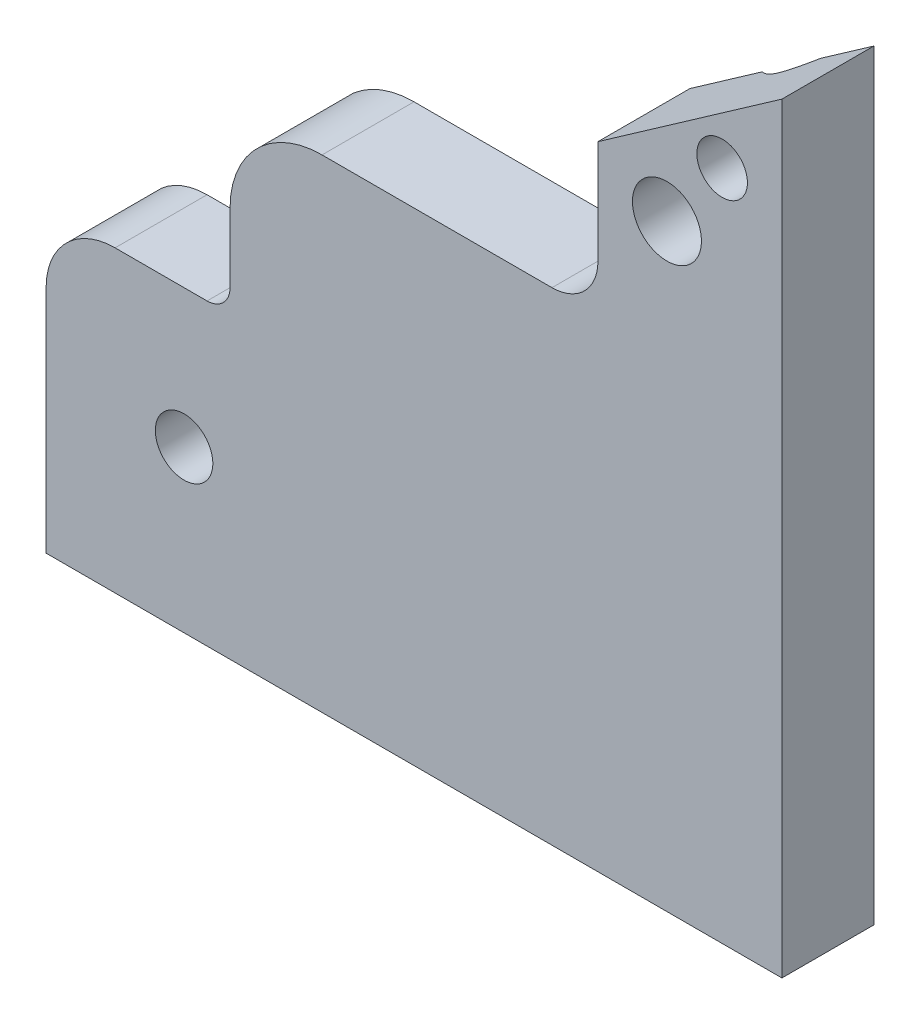
ISO-10303-21;
HEADER;
FILE_DESCRIPTION(('STEP AP214'),'2;1');
FILE_NAME('part.step','',(''),(''),'','','');
FILE_SCHEMA(('AUTOMOTIVE_DESIGN { 1 0 10303 214 1 1 1 1 }'));
ENDSEC;
DATA;
#1=APPLICATION_CONTEXT('core data for automotive mechanical design processes');
#2=APPLICATION_PROTOCOL_DEFINITION('international standard','automotive_design',2000,#1);
#3=PRODUCT_CONTEXT('',#1,'mechanical');
#4=PRODUCT('Part','Part','',(#3));
#5=PRODUCT_RELATED_PRODUCT_CATEGORY('part','',(#4));
#6=PRODUCT_DEFINITION_FORMATION('','',#4);
#7=PRODUCT_DEFINITION_CONTEXT('part definition',#1,'design');
#8=PRODUCT_DEFINITION('design','',#6,#7);
#9=PRODUCT_DEFINITION_SHAPE('','',#8);
#10=(LENGTH_UNIT() NAMED_UNIT(*) SI_UNIT(.MILLI.,.METRE.));
#11=(NAMED_UNIT(*) PLANE_ANGLE_UNIT() SI_UNIT($,.RADIAN.));
#12=(NAMED_UNIT(*) SI_UNIT($,.STERADIAN.) SOLID_ANGLE_UNIT());
#13=UNCERTAINTY_MEASURE_WITH_UNIT(LENGTH_MEASURE(1.E-05),#10,'distance_accuracy_value','');
#14=(GEOMETRIC_REPRESENTATION_CONTEXT(3) GLOBAL_UNCERTAINTY_ASSIGNED_CONTEXT((#13)) GLOBAL_UNIT_ASSIGNED_CONTEXT((#10,
#11,#12)) REPRESENTATION_CONTEXT('',''));
#15=CARTESIAN_POINT('',(0.,0.,0.));
#16=DIRECTION('',(0.,0.,1.));
#17=DIRECTION('',(1.,0.,0.));
#18=AXIS2_PLACEMENT_3D('',#15,#16,#17);
#19=CARTESIAN_POINT('',(0.,0.,0.));
#20=DIRECTION('',(0.,0.,1.));
#21=DIRECTION('',(1.,0.,0.));
#22=AXIS2_PLACEMENT_3D('',#19,#20,#21);
#23=PLANE('',#22);
#24=DIRECTION('',(0.,-1.,0.));
#25=VECTOR('',#24,1.);
#26=CARTESIAN_POINT('',(8.,25.5,0.));
#27=LINE('',#26,#25);
#28=CARTESIAN_POINT('',(8.,15.,0.));
#29=VERTEX_POINT('',#28);
#30=CARTESIAN_POINT('',(8.,12.,0.));
#31=VERTEX_POINT('',#30);
#32=EDGE_CURVE('E190',#29,#31,#27,.T.);
#33=ORIENTED_EDGE('',*,*,#32,.F.);
#34=CARTESIAN_POINT('',(12.,15.,0.));
#35=DIRECTION('',(0.,0.,1.));
#36=DIRECTION('',(1.,0.,0.));
#37=AXIS2_PLACEMENT_3D('',#34,#35,#36);
#38=CIRCLE('',#37,4.);
#39=CARTESIAN_POINT('',(12.,19.,0.));
#40=VERTEX_POINT('',#39);
#41=EDGE_CURVE('E56',#29,#40,#38,.F.);
#42=ORIENTED_EDGE('',*,*,#41,.T.);
#43=DIRECTION('',(-1.,0.,0.));
#44=VECTOR('',#43,1.);
#45=CARTESIAN_POINT('',(24.,19.,0.));
#46=LINE('',#45,#44);
#47=CARTESIAN_POINT('',(22.,19.,0.));
#48=VERTEX_POINT('',#47);
#49=EDGE_CURVE('E182',#48,#40,#46,.T.);
#50=ORIENTED_EDGE('',*,*,#49,.F.);
#51=CARTESIAN_POINT('',(22.,21.,0.));
#52=DIRECTION('',(0.,0.,1.));
#53=DIRECTION('',(1.,0.,0.));
#54=AXIS2_PLACEMENT_3D('',#51,#52,#53);
#55=CIRCLE('',#54,2.);
#56=CARTESIAN_POINT('',(24.,21.,0.));
#57=VERTEX_POINT('',#56);
#58=EDGE_CURVE('E319',#48,#57,#55,.T.);
#59=ORIENTED_EDGE('',*,*,#58,.T.);
#60=DIRECTION('',(0.,-1.,0.));
#61=VECTOR('',#60,1.);
#62=CARTESIAN_POINT('',(24.,25.5,0.));
#63=LINE('',#62,#61);
#64=CARTESIAN_POINT('',(24.,25.5,0.));
#65=VERTEX_POINT('',#64);
#66=EDGE_CURVE('E177',#65,#57,#63,.T.);
#67=ORIENTED_EDGE('',*,*,#66,.F.);
#68=DIRECTION('',(-0.819152044273483,-0.573576436373195,0.));
#69=VECTOR('',#68,1.);
#70=CARTESIAN_POINT('',(-4.08532263455438,5.83444537710152,0.));
#71=LINE('',#70,#69);
#72=CARTESIAN_POINT('',(27.1574550289357,27.7108738129462,0.));
#73=VERTEX_POINT('',#72);
#74=EDGE_CURVE('E204',#73,#65,#71,.T.);
#75=ORIENTED_EDGE('',*,*,#74,.F.);
#76=CARTESIAN_POINT('',(29.4,27.2,0.));
#77=DIRECTION('',(0.,0.,-1.));
#78=DIRECTION('',(-1.,0.,0.));
#79=AXIS2_PLACEMENT_3D('',#76,#77,#78);
#80=CIRCLE('',#79,2.3);
#81=CARTESIAN_POINT('',(29.686931200116,29.4820320958304,0.));
#82=VERTEX_POINT('',#81);
#83=EDGE_CURVE('E165',#82,#73,#80,.T.);
#84=ORIENTED_EDGE('',*,*,#83,.F.);
#85=CARTESIAN_POINT('',(32.,31.101660306,0.));
#86=VERTEX_POINT('',#85);
#87=EDGE_CURVE('E209',#86,#82,#71,.T.);
#88=ORIENTED_EDGE('',*,*,#87,.F.);
#89=DIRECTION('',(0.,1.,0.));
#90=VECTOR('',#89,1.);
#91=CARTESIAN_POINT('',(32.,-2.,0.));
#92=LINE('',#91,#90);
#93=CARTESIAN_POINT('',(32.,-2.,0.));
#94=VERTEX_POINT('',#93);
#95=EDGE_CURVE('E201',#94,#86,#92,.T.);
#96=ORIENTED_EDGE('',*,*,#95,.F.);
#97=DIRECTION('',(1.,0.,0.));
#98=VECTOR('',#97,1.);
#99=CARTESIAN_POINT('',(0.,-2.,0.));
#100=LINE('',#99,#98);
#101=CARTESIAN_POINT('',(0.,-2.,0.));
#102=VERTEX_POINT('',#101);
#103=EDGE_CURVE('E208',#102,#94,#100,.T.);
#104=ORIENTED_EDGE('',*,*,#103,.F.);
#105=DIRECTION('',(0.,-1.,0.));
#106=VECTOR('',#105,1.);
#107=CARTESIAN_POINT('',(0.,25.5,0.));
#108=LINE('',#107,#106);
#109=CARTESIAN_POINT('',(0.,8.,0.));
#110=VERTEX_POINT('',#109);
#111=EDGE_CURVE('E206',#110,#102,#108,.T.);
#112=ORIENTED_EDGE('',*,*,#111,.F.);
#113=CARTESIAN_POINT('',(3.,8.,0.));
#114=DIRECTION('',(0.,0.,1.));
#115=DIRECTION('',(1.,0.,0.));
#116=AXIS2_PLACEMENT_3D('',#113,#114,#115);
#117=CIRCLE('',#116,3.);
#118=CARTESIAN_POINT('',(3.,11.,0.));
#119=VERTEX_POINT('',#118);
#120=EDGE_CURVE('E322',#110,#119,#117,.F.);
#121=ORIENTED_EDGE('',*,*,#120,.T.);
#122=DIRECTION('',(-1.,0.,0.));
#123=VECTOR('',#122,1.);
#124=CARTESIAN_POINT('',(8.,11.,0.));
#125=LINE('',#124,#123);
#126=CARTESIAN_POINT('',(7.,11.,0.));
#127=VERTEX_POINT('',#126);
#128=EDGE_CURVE('E194',#127,#119,#125,.T.);
#129=ORIENTED_EDGE('',*,*,#128,.F.);
#130=CARTESIAN_POINT('',(7.,12.,0.));
#131=DIRECTION('',(0.,0.,1.));
#132=DIRECTION('',(1.,0.,0.));
#133=AXIS2_PLACEMENT_3D('',#130,#131,#132);
#134=CIRCLE('',#133,1.);
#135=EDGE_CURVE('E342',#127,#31,#134,.T.);
#136=ORIENTED_EDGE('',*,*,#135,.T.);
#137=EDGE_LOOP('',(#33,#42,#50,#59,#67,#75,#84,#88,#96,#104,#112,#121,#129,#136));
#138=FACE_BOUND('',#137,.T.);
#139=CARTESIAN_POINT('',(27.,24.,0.));
#140=DIRECTION('',(0.,0.,-1.));
#141=DIRECTION('',(-1.,0.,0.));
#142=AXIS2_PLACEMENT_3D('',#139,#140,#141);
#143=CIRCLE('',#142,1.5);
#144=CARTESIAN_POINT('',(25.5,24.,0.));
#145=VERTEX_POINT('',#144);
#146=EDGE_CURVE('E171',#145,#145,#143,.T.);
#147=ORIENTED_EDGE('',*,*,#146,.F.);
#148=EDGE_LOOP('',(#147));
#149=FACE_BOUND('',#148,.T.);
#150=CARTESIAN_POINT('',(6.,5.,0.));
#151=DIRECTION('',(0.,0.,-1.));
#152=DIRECTION('',(-1.,0.,0.));
#153=AXIS2_PLACEMENT_3D('',#150,#151,#152);
#154=CIRCLE('',#153,1.24999999999999);
#155=CARTESIAN_POINT('',(4.75000000000001,5.,0.));
#156=VERTEX_POINT('',#155);
#157=EDGE_CURVE('E545',#156,#156,#154,.T.);
#158=ORIENTED_EDGE('',*,*,#157,.F.);
#159=EDGE_LOOP('',(#158));
#160=FACE_BOUND('',#159,.T.);
#161=ADVANCED_FACE('F34',(#138,#149,#160),#23,.F.);
#162=CARTESIAN_POINT('',(32.,-2.,0.));
#163=DIRECTION('',(1.,0.,0.));
#164=DIRECTION('',(0.,0.,-1.));
#165=AXIS2_PLACEMENT_3D('',#162,#163,#164);
#166=PLANE('',#165);
#167=DIRECTION('',(0.,1.,0.));
#168=VECTOR('',#167,1.);
#169=CARTESIAN_POINT('',(32.,-2.,4.));
#170=LINE('',#169,#168);
#171=CARTESIAN_POINT('',(32.,-2.,4.));
#172=VERTEX_POINT('',#171);
#173=CARTESIAN_POINT('',(32.,31.101660306,4.));
#174=VERTEX_POINT('',#173);
#175=EDGE_CURVE('E197',#172,#174,#170,.T.);
#176=ORIENTED_EDGE('',*,*,#175,.F.);
#177=DIRECTION('',(0.,0.,1.));
#178=VECTOR('',#177,1.);
#179=CARTESIAN_POINT('',(32.,-2.,0.));
#180=LINE('',#179,#178);
#181=EDGE_CURVE('E220',#94,#172,#180,.T.);
#182=ORIENTED_EDGE('',*,*,#181,.F.);
#183=ORIENTED_EDGE('',*,*,#95,.T.);
#184=DIRECTION('',(0.,0.,1.));
#185=VECTOR('',#184,1.);
#186=CARTESIAN_POINT('',(32.,31.101660306,0.));
#187=LINE('',#186,#185);
#188=EDGE_CURVE('E212',#86,#174,#187,.T.);
#189=ORIENTED_EDGE('',*,*,#188,.T.);
#190=EDGE_LOOP('',(#176,#182,#183,#189));
#191=FACE_BOUND('',#190,.T.);
#192=ADVANCED_FACE('F277',(#191),#166,.T.);
#193=CARTESIAN_POINT('',(0.,-2.,0.));
#194=DIRECTION('',(0.,-1.,0.));
#195=DIRECTION('',(0.,0.,-1.));
#196=AXIS2_PLACEMENT_3D('',#193,#194,#195);
#197=PLANE('',#196);
#198=CARTESIAN_POINT('',(10.,-2.,2.));
#199=DIRECTION('',(0.,-1.,0.));
#200=DIRECTION('',(0.,0.,-1.));
#201=AXIS2_PLACEMENT_3D('',#198,#199,#200);
#202=CIRCLE('',#201,1.25);
#203=CARTESIAN_POINT('',(10.,-2.,0.750000000000001));
#204=VERTEX_POINT('',#203);
#205=EDGE_CURVE('E147',#204,#204,#202,.T.);
#206=ORIENTED_EDGE('',*,*,#205,.F.);
#207=EDGE_LOOP('',(#206));
#208=FACE_BOUND('',#207,.T.);
#209=CARTESIAN_POINT('',(19.5,-2.,2.));
#210=DIRECTION('',(0.,-1.,0.));
#211=DIRECTION('',(0.,0.,-1.));
#212=AXIS2_PLACEMENT_3D('',#209,#210,#211);
#213=CIRCLE('',#212,1.25);
#214=CARTESIAN_POINT('',(19.5,-2.,0.750000000000002));
#215=VERTEX_POINT('',#214);
#216=EDGE_CURVE('E146',#215,#215,#213,.T.);
#217=ORIENTED_EDGE('',*,*,#216,.F.);
#218=EDGE_LOOP('',(#217));
#219=FACE_BOUND('',#218,.T.);
#220=CARTESIAN_POINT('',(29.,-2.,2.));
#221=DIRECTION('',(0.,-1.,0.));
#222=DIRECTION('',(0.,0.,-1.));
#223=AXIS2_PLACEMENT_3D('',#220,#221,#222);
#224=CIRCLE('',#223,1.25);
#225=CARTESIAN_POINT('',(29.,-2.,0.750000000000002));
#226=VERTEX_POINT('',#225);
#227=EDGE_CURVE('E159',#226,#226,#224,.T.);
#228=ORIENTED_EDGE('',*,*,#227,.F.);
#229=EDGE_LOOP('',(#228));
#230=FACE_BOUND('',#229,.T.);
#231=DIRECTION('',(1.,0.,0.));
#232=VECTOR('',#231,1.);
#233=CARTESIAN_POINT('',(0.,-2.,4.));
#234=LINE('',#233,#232);
#235=CARTESIAN_POINT('',(0.,-2.,4.));
#236=VERTEX_POINT('',#235);
#237=EDGE_CURVE('E205',#236,#172,#234,.T.);
#238=ORIENTED_EDGE('',*,*,#237,.F.);
#239=DIRECTION('',(0.,0.,1.));
#240=VECTOR('',#239,1.);
#241=CARTESIAN_POINT('',(0.,-2.,0.));
#242=LINE('',#241,#240);
#243=EDGE_CURVE('E223',#102,#236,#242,.T.);
#244=ORIENTED_EDGE('',*,*,#243,.F.);
#245=ORIENTED_EDGE('',*,*,#103,.T.);
#246=ORIENTED_EDGE('',*,*,#181,.T.);
#247=EDGE_LOOP('',(#238,#244,#245,#246));
#248=FACE_BOUND('',#247,.T.);
#249=ADVANCED_FACE('F281',(#208,#219,#230,#248),#197,.T.);
#250=CARTESIAN_POINT('',(0.,25.5,0.));
#251=DIRECTION('',(-1.,0.,0.));
#252=DIRECTION('',(0.,-1.,0.));
#253=AXIS2_PLACEMENT_3D('',#250,#251,#252);
#254=PLANE('',#253);
#255=DIRECTION('',(0.,-1.,0.));
#256=VECTOR('',#255,1.);
#257=CARTESIAN_POINT('',(0.,25.5,4.));
#258=LINE('',#257,#256);
#259=CARTESIAN_POINT('',(0.,8.,4.));
#260=VERTEX_POINT('',#259);
#261=EDGE_CURVE('E216',#260,#236,#258,.T.);
#262=ORIENTED_EDGE('',*,*,#261,.F.);
#263=DIRECTION('',(0.,0.,-1.));
#264=VECTOR('',#263,1.);
#265=CARTESIAN_POINT('',(0.,8.,0.));
#266=LINE('',#265,#264);
#267=EDGE_CURVE('E318',#260,#110,#266,.T.);
#268=ORIENTED_EDGE('',*,*,#267,.T.);
#269=ORIENTED_EDGE('',*,*,#111,.T.);
#270=ORIENTED_EDGE('',*,*,#243,.T.);
#271=EDGE_LOOP('',(#262,#268,#269,#270));
#272=FACE_BOUND('',#271,.T.);
#273=ADVANCED_FACE('F284',(#272),#254,.T.);
#274=CARTESIAN_POINT('',(24.,25.5,4.));
#275=DIRECTION('',(-0.573576436373195,0.819152044273483,0.));
#276=DIRECTION('',(-0.819152044273483,-0.573576436373195,0.));
#277=AXIS2_PLACEMENT_3D('',#274,#275,#276);
#278=PLANE('',#277);
#279=CARTESIAN_POINT('',(27.1572109876764,27.7107029334168,-0.0002));
#280=CARTESIAN_POINT('',(27.1880687445066,27.7323097673627,0.0250869134946358));
#281=CARTESIAN_POINT('',(27.219116219488,27.7540494433884,0.0500282624330559));
#282=CARTESIAN_POINT('',(27.2816492413318,27.797835536673,0.0991002916575126));
#283=CARTESIAN_POINT('',(27.3131349018793,27.8198820335351,0.12323075580195));
#284=CARTESIAN_POINT('',(27.4086620232363,27.8867708440166,0.194467188023854));
#285=CARTESIAN_POINT('',(27.4734347562653,27.9321251999566,0.240136732280424));
#286=CARTESIAN_POINT('',(27.6073721543186,28.025909175727,0.327511160101129));
#287=CARTESIAN_POINT('',(27.6766107188955,28.0743905405814,0.369049318277156));
#288=CARTESIAN_POINT('',(27.8178627034772,28.1732962449783,0.44407171695257));
#289=CARTESIAN_POINT('',(27.8898691955202,28.2237157335098,0.477574717314257));
#290=CARTESIAN_POINT('',(28.0050540975857,28.3043690702286,0.521472091962881));
#291=CARTESIAN_POINT('',(28.0472769600615,28.3339338368207,0.535601959801439));
#292=CARTESIAN_POINT('',(28.132529404966,28.393628241397,0.559692644247479));
#293=CARTESIAN_POINT('',(28.1755590181108,28.423757900889,0.569653301778984));
#294=CARTESIAN_POINT('',(28.2616379729539,28.4840310339548,0.584792617524067));
#295=CARTESIAN_POINT('',(28.3046803483385,28.5141696296633,0.590029479186951));
#296=CARTESIAN_POINT('',(28.3909776484867,28.5745956497577,0.595631054094481));
#297=CARTESIAN_POINT('',(28.4342325565882,28.6048830624767,0.595996143364286));
#298=CARTESIAN_POINT('',(28.5206161300937,28.6653694918262,0.591829609416954));
#299=CARTESIAN_POINT('',(28.5637446707586,28.6955684211134,0.587294167715424));
#300=CARTESIAN_POINT('',(28.6494966989118,28.7556126376466,0.573591294677424));
#301=CARTESIAN_POINT('',(28.6921201255813,28.7854578823066,0.564423311237368));
#302=CARTESIAN_POINT('',(28.8198732693915,28.8749115966376,0.53038960228114));
#303=CARTESIAN_POINT('',(28.9038637699842,28.933722378294,0.499060777468119));
#304=CARTESIAN_POINT('',(29.0491428320469,29.0354478727002,0.432703917413774));
#305=CARTESIAN_POINT('',(29.1112398028098,29.0789286397309,0.400149594941954));
#306=CARTESIAN_POINT('',(29.2333975687916,29.1644644283271,0.32957581406476));
#307=CARTESIAN_POINT('',(29.2934557680715,29.2065176321966,0.291549688952737));
#308=CARTESIAN_POINT('',(29.4099914059132,29.2881167642882,0.212677951941584));
#309=CARTESIAN_POINT('',(29.4665222033486,29.3277000547957,0.171947761696717));
#310=CARTESIAN_POINT('',(29.577951586281,29.4057237487076,0.0877378648693489));
#311=CARTESIAN_POINT('',(29.6328547693282,29.4441673713511,0.0442672635096658));
#312=CARTESIAN_POINT('',(29.6871752413753,29.4822029753598,-0.000200000000000443));
#313=B_SPLINE_CURVE_WITH_KNOTS('',3,(#279,#280,#281,#282,#283,#284,#285,#286,#287,#288,#289,
#290,#291,#292,#293,#294,#295,#296,#297,#298,#299,#300,#301,#302,#303,#304,#305,#306,#307,#308,
#309,#310,#311,#312),.UNSPECIFIED.,.F.,.F.,(4,2,2,2,2,2,2,2,2,2,2,2,2,2,2,2,4),(0.,
0.136107448133705,0.272250892530429,0.546037490513632,0.828308752564634,1.10991443035279,
1.27011034893965,1.43031237923537,1.58851242096431,1.74670025203662,1.90501143171284,
2.06334148327353,2.38370159800647,2.63098941649178,2.8785811161621,3.11891025636132,
3.35847915440163),.UNSPECIFIED.);
#314=EDGE_CURVE('E222',#73,#82,#313,.T.);
#315=ORIENTED_EDGE('',*,*,#314,.F.);
#316=ORIENTED_EDGE('',*,*,#74,.T.);
#317=DIRECTION('',(0.,0.,-1.));
#318=VECTOR('',#317,1.);
#319=CARTESIAN_POINT('',(24.,25.5,4.));
#320=LINE('',#319,#318);
#321=CARTESIAN_POINT('',(24.,25.5,4.));
#322=VERTEX_POINT('',#321);
#323=EDGE_CURVE('E184',#322,#65,#320,.T.);
#324=ORIENTED_EDGE('',*,*,#323,.F.);
#325=DIRECTION('',(-0.819152044273483,-0.573576436373195,0.));
#326=VECTOR('',#325,1.);
#327=CARTESIAN_POINT('',(-4.08532263455438,5.83444537710152,4.));
#328=LINE('',#327,#326);
#329=EDGE_CURVE('E215',#174,#322,#328,.T.);
#330=ORIENTED_EDGE('',*,*,#329,.F.);
#331=ORIENTED_EDGE('',*,*,#188,.F.);
#332=ORIENTED_EDGE('',*,*,#87,.T.);
#333=EDGE_LOOP('',(#315,#316,#324,#330,#331,#332));
#334=FACE_BOUND('',#333,.T.);
#335=ADVANCED_FACE('F239',(#334),#278,.T.);
#336=CARTESIAN_POINT('',(0.,0.,4.));
#337=DIRECTION('',(0.,0.,1.));
#338=DIRECTION('',(1.,0.,0.));
#339=AXIS2_PLACEMENT_3D('',#336,#337,#338);
#340=PLANE('',#339);
#341=CARTESIAN_POINT('',(6.,5.,4.));
#342=DIRECTION('',(0.,0.,-1.));
#343=DIRECTION('',(-1.,0.,0.));
#344=AXIS2_PLACEMENT_3D('',#341,#342,#343);
#345=CIRCLE('',#344,1.25);
#346=CARTESIAN_POINT('',(4.75,5.,4.));
#347=VERTEX_POINT('',#346);
#348=EDGE_CURVE('E153',#347,#347,#345,.T.);
#349=ORIENTED_EDGE('',*,*,#348,.T.);
#350=EDGE_LOOP('',(#349));
#351=FACE_BOUND('',#350,.T.);
#352=CARTESIAN_POINT('',(29.4,27.2,4.));
#353=DIRECTION('',(0.,0.,1.));
#354=DIRECTION('',(1.,0.,0.));
#355=AXIS2_PLACEMENT_3D('',#352,#353,#354);
#356=CIRCLE('',#355,1.09999999999999);
#357=CARTESIAN_POINT('',(30.5,27.2,4.));
#358=VERTEX_POINT('',#357);
#359=EDGE_CURVE('E170',#358,#358,#356,.T.);
#360=ORIENTED_EDGE('',*,*,#359,.F.);
#361=EDGE_LOOP('',(#360));
#362=FACE_BOUND('',#361,.T.);
#363=CARTESIAN_POINT('',(27.,24.,4.));
#364=DIRECTION('',(0.,0.,-1.));
#365=DIRECTION('',(-1.,0.,0.));
#366=AXIS2_PLACEMENT_3D('',#363,#364,#365);
#367=CIRCLE('',#366,1.5);
#368=CARTESIAN_POINT('',(25.5,24.,4.));
#369=VERTEX_POINT('',#368);
#370=EDGE_CURVE('E174',#369,#369,#367,.T.);
#371=ORIENTED_EDGE('',*,*,#370,.T.);
#372=EDGE_LOOP('',(#371));
#373=FACE_BOUND('',#372,.T.);
#374=DIRECTION('',(-1.,0.,0.));
#375=VECTOR('',#374,1.);
#376=CARTESIAN_POINT('',(24.,19.,4.));
#377=LINE('',#376,#375);
#378=CARTESIAN_POINT('',(22.,19.,4.));
#379=VERTEX_POINT('',#378);
#380=CARTESIAN_POINT('',(12.,19.,4.));
#381=VERTEX_POINT('',#380);
#382=EDGE_CURVE('E181',#379,#381,#377,.T.);
#383=ORIENTED_EDGE('',*,*,#382,.T.);
#384=CARTESIAN_POINT('',(12.,15.,4.));
#385=DIRECTION('',(0.,0.,1.));
#386=DIRECTION('',(1.,0.,0.));
#387=AXIS2_PLACEMENT_3D('',#384,#385,#386);
#388=CIRCLE('',#387,4.);
#389=CARTESIAN_POINT('',(8.,15.,4.));
#390=VERTEX_POINT('',#389);
#391=EDGE_CURVE('E11',#381,#390,#388,.T.);
#392=ORIENTED_EDGE('',*,*,#391,.T.);
#393=DIRECTION('',(0.,-1.,0.));
#394=VECTOR('',#393,1.);
#395=CARTESIAN_POINT('',(8.,25.5,4.));
#396=LINE('',#395,#394);
#397=CARTESIAN_POINT('',(8.,12.,4.));
#398=VERTEX_POINT('',#397);
#399=EDGE_CURVE('E191',#390,#398,#396,.T.);
#400=ORIENTED_EDGE('',*,*,#399,.T.);
#401=CARTESIAN_POINT('',(7.,12.,4.));
#402=DIRECTION('',(0.,0.,1.));
#403=DIRECTION('',(1.,0.,0.));
#404=AXIS2_PLACEMENT_3D('',#401,#402,#403);
#405=CIRCLE('',#404,1.);
#406=CARTESIAN_POINT('',(7.,11.,4.));
#407=VERTEX_POINT('',#406);
#408=EDGE_CURVE('E347',#398,#407,#405,.F.);
#409=ORIENTED_EDGE('',*,*,#408,.T.);
#410=DIRECTION('',(-1.,0.,0.));
#411=VECTOR('',#410,1.);
#412=CARTESIAN_POINT('',(8.,11.,4.));
#413=LINE('',#412,#411);
#414=CARTESIAN_POINT('',(3.,11.,4.));
#415=VERTEX_POINT('',#414);
#416=EDGE_CURVE('E193',#407,#415,#413,.T.);
#417=ORIENTED_EDGE('',*,*,#416,.T.);
#418=CARTESIAN_POINT('',(3.,8.,4.));
#419=DIRECTION('',(0.,0.,1.));
#420=DIRECTION('',(1.,0.,0.));
#421=AXIS2_PLACEMENT_3D('',#418,#419,#420);
#422=CIRCLE('',#421,3.);
#423=EDGE_CURVE('E330',#415,#260,#422,.T.);
#424=ORIENTED_EDGE('',*,*,#423,.T.);
#425=ORIENTED_EDGE('',*,*,#261,.T.);
#426=ORIENTED_EDGE('',*,*,#237,.T.);
#427=ORIENTED_EDGE('',*,*,#175,.T.);
#428=ORIENTED_EDGE('',*,*,#329,.T.);
#429=DIRECTION('',(0.,-1.,0.));
#430=VECTOR('',#429,1.);
#431=CARTESIAN_POINT('',(24.,25.5,4.));
#432=LINE('',#431,#430);
#433=CARTESIAN_POINT('',(24.,21.,4.));
#434=VERTEX_POINT('',#433);
#435=EDGE_CURVE('E178',#322,#434,#432,.T.);
#436=ORIENTED_EDGE('',*,*,#435,.T.);
#437=CARTESIAN_POINT('',(22.,21.,4.));
#438=DIRECTION('',(0.,0.,1.));
#439=DIRECTION('',(1.,0.,0.));
#440=AXIS2_PLACEMENT_3D('',#437,#438,#439);
#441=CIRCLE('',#440,2.);
#442=EDGE_CURVE('E310',#434,#379,#441,.F.);
#443=ORIENTED_EDGE('',*,*,#442,.T.);
#444=EDGE_LOOP('',(#383,#392,#400,#409,#417,#424,#425,#426,#427,#428,#436,#443));
#445=FACE_BOUND('',#444,.T.);
#446=ADVANCED_FACE('F270',(#351,#362,#373,#445),#340,.T.);
#447=CARTESIAN_POINT('',(8.,11.,4.));
#448=DIRECTION('',(0.,-1.,0.));
#449=DIRECTION('',(1.,0.,0.));
#450=AXIS2_PLACEMENT_3D('',#447,#448,#449);
#451=PLANE('',#450);
#452=ORIENTED_EDGE('',*,*,#128,.T.);
#453=DIRECTION('',(0.,0.,-1.));
#454=VECTOR('',#453,1.);
#455=CARTESIAN_POINT('',(3.,11.,4.));
#456=LINE('',#455,#454);
#457=EDGE_CURVE('E328',#119,#415,#456,.F.);
#458=ORIENTED_EDGE('',*,*,#457,.T.);
#459=ORIENTED_EDGE('',*,*,#416,.F.);
#460=DIRECTION('',(0.,0.,-1.));
#461=VECTOR('',#460,1.);
#462=CARTESIAN_POINT('',(7.,11.,0.));
#463=LINE('',#462,#461);
#464=EDGE_CURVE('E237',#407,#127,#463,.T.);
#465=ORIENTED_EDGE('',*,*,#464,.T.);
#466=EDGE_LOOP('',(#452,#458,#459,#465));
#467=FACE_BOUND('',#466,.T.);
#468=ADVANCED_FACE('F267',(#467),#451,.F.);
#469=CARTESIAN_POINT('',(8.,25.5,4.));
#470=DIRECTION('',(1.,0.,0.));
#471=DIRECTION('',(0.,1.,0.));
#472=AXIS2_PLACEMENT_3D('',#469,#470,#471);
#473=PLANE('',#472);
#474=ORIENTED_EDGE('',*,*,#399,.F.);
#475=DIRECTION('',(0.,0.,-1.));
#476=VECTOR('',#475,1.);
#477=CARTESIAN_POINT('',(8.,15.,4.));
#478=LINE('',#477,#476);
#479=EDGE_CURVE('E332',#390,#29,#478,.T.);
#480=ORIENTED_EDGE('',*,*,#479,.T.);
#481=ORIENTED_EDGE('',*,*,#32,.T.);
#482=DIRECTION('',(0.,0.,-1.));
#483=VECTOR('',#482,1.);
#484=CARTESIAN_POINT('',(8.,12.,4.));
#485=LINE('',#484,#483);
#486=EDGE_CURVE('E348',#31,#398,#485,.F.);
#487=ORIENTED_EDGE('',*,*,#486,.T.);
#488=EDGE_LOOP('',(#474,#480,#481,#487));
#489=FACE_BOUND('',#488,.T.);
#490=ADVANCED_FACE('F263',(#489),#473,.F.);
#491=CARTESIAN_POINT('',(24.,19.,4.));
#492=DIRECTION('',(0.,-1.,0.));
#493=DIRECTION('',(0.,0.,-1.));
#494=AXIS2_PLACEMENT_3D('',#491,#492,#493);
#495=PLANE('',#494);
#496=ORIENTED_EDGE('',*,*,#49,.T.);
#497=DIRECTION('',(0.,0.,-1.));
#498=VECTOR('',#497,1.);
#499=CARTESIAN_POINT('',(12.,19.,4.));
#500=LINE('',#499,#498);
#501=EDGE_CURVE('E42',#40,#381,#500,.F.);
#502=ORIENTED_EDGE('',*,*,#501,.T.);
#503=ORIENTED_EDGE('',*,*,#382,.F.);
#504=DIRECTION('',(0.,0.,-1.));
#505=VECTOR('',#504,1.);
#506=CARTESIAN_POINT('',(22.,19.,0.));
#507=LINE('',#506,#505);
#508=EDGE_CURVE('E317',#379,#48,#507,.T.);
#509=ORIENTED_EDGE('',*,*,#508,.T.);
#510=EDGE_LOOP('',(#496,#502,#503,#509));
#511=FACE_BOUND('',#510,.T.);
#512=ADVANCED_FACE('F260',(#511),#495,.F.);
#513=CARTESIAN_POINT('',(24.,25.5,4.));
#514=DIRECTION('',(1.,0.,0.));
#515=DIRECTION('',(0.,0.,-1.));
#516=AXIS2_PLACEMENT_3D('',#513,#514,#515);
#517=PLANE('',#516);
#518=ORIENTED_EDGE('',*,*,#66,.T.);
#519=DIRECTION('',(0.,0.,-1.));
#520=VECTOR('',#519,1.);
#521=CARTESIAN_POINT('',(24.,21.,4.));
#522=LINE('',#521,#520);
#523=EDGE_CURVE('E315',#57,#434,#522,.F.);
#524=ORIENTED_EDGE('',*,*,#523,.T.);
#525=ORIENTED_EDGE('',*,*,#435,.F.);
#526=ORIENTED_EDGE('',*,*,#323,.T.);
#527=EDGE_LOOP('',(#518,#524,#525,#526));
#528=FACE_BOUND('',#527,.T.);
#529=ADVANCED_FACE('F258',(#528),#517,.F.);
#530=CARTESIAN_POINT('',(27.,24.,0.));
#531=DIRECTION('',(0.,0.,-1.));
#532=DIRECTION('',(-1.,0.,0.));
#533=AXIS2_PLACEMENT_3D('',#530,#531,#532);
#534=CYLINDRICAL_SURFACE('',#533,1.5);
#535=ORIENTED_EDGE('',*,*,#370,.F.);
#536=EDGE_LOOP('',(#535));
#537=FACE_BOUND('',#536,.T.);
#538=ORIENTED_EDGE('',*,*,#146,.T.);
#539=EDGE_LOOP('',(#538));
#540=FACE_BOUND('',#539,.T.);
#541=ADVANCED_FACE('F254',(#537,#540),#534,.F.);
#542=CARTESIAN_POINT('',(29.4,27.2,0.));
#543=DIRECTION('',(0.,0.,-1.));
#544=DIRECTION('',(-1.,0.,0.));
#545=AXIS2_PLACEMENT_3D('',#542,#543,#544);
#546=CYLINDRICAL_SURFACE('',#545,1.09999999999999);
#547=ORIENTED_EDGE('',*,*,#359,.T.);
#548=EDGE_LOOP('',(#547));
#549=FACE_BOUND('',#548,.T.);
#550=CARTESIAN_POINT('',(29.4,27.2,1.20000000000001));
#551=DIRECTION('',(0.,0.,-1.));
#552=DIRECTION('',(-1.,0.,0.));
#553=AXIS2_PLACEMENT_3D('',#550,#551,#552);
#554=CIRCLE('',#553,1.09999999999999);
#555=CARTESIAN_POINT('',(28.3,27.2,1.20000000000001));
#556=VERTEX_POINT('',#555);
#557=EDGE_CURVE('E167',#556,#556,#554,.T.);
#558=ORIENTED_EDGE('',*,*,#557,.T.);
#559=EDGE_LOOP('',(#558));
#560=FACE_BOUND('',#559,.T.);
#561=ADVANCED_FACE('F249',(#549,#560),#546,.F.);
#562=CARTESIAN_POINT('',(29.4,27.2,0.));
#563=DIRECTION('',(0.,0.,-1.));
#564=DIRECTION('',(-1.,0.,0.));
#565=AXIS2_PLACEMENT_3D('',#562,#563,#564);
#566=CONICAL_SURFACE('',#565,2.3,0.78539816339745);
#567=ORIENTED_EDGE('',*,*,#314,.T.);
#568=ORIENTED_EDGE('',*,*,#83,.T.);
#569=EDGE_LOOP('',(#567,#568));
#570=FACE_BOUND('',#569,.T.);
#571=ORIENTED_EDGE('',*,*,#557,.F.);
#572=EDGE_LOOP('',(#571));
#573=FACE_BOUND('',#572,.T.);
#574=ADVANCED_FACE('F243',(#570,#573),#566,.F.);
#575=CARTESIAN_POINT('',(29.,5.5,2.));
#576=DIRECTION('',(0.,-1.,0.));
#577=DIRECTION('',(0.,0.,-1.));
#578=AXIS2_PLACEMENT_3D('',#575,#576,#577);
#579=CONICAL_SURFACE('',#578,1.25,1.02974425867665);
#580=CARTESIAN_POINT('',(29.,6.25107577378445,2.));
#581=VERTEX_POINT('',#580);
#582=VERTEX_LOOP('',#581);
#583=FACE_BOUND('',#582,.T.);
#584=CARTESIAN_POINT('',(29.,5.5,2.));
#585=DIRECTION('',(0.,-1.,0.));
#586=DIRECTION('',(0.,0.,-1.));
#587=AXIS2_PLACEMENT_3D('',#584,#585,#586);
#588=CIRCLE('',#587,1.25);
#589=CARTESIAN_POINT('',(29.,5.5,0.750000000000002));
#590=VERTEX_POINT('',#589);
#591=EDGE_CURVE('E162',#590,#590,#588,.T.);
#592=ORIENTED_EDGE('',*,*,#591,.T.);
#593=EDGE_LOOP('',(#592));
#594=FACE_BOUND('',#593,.T.);
#595=ADVANCED_FACE('F248',(#583,#594),#579,.F.);
#596=CARTESIAN_POINT('',(29.,-2.,2.));
#597=DIRECTION('',(0.,-1.,0.));
#598=DIRECTION('',(0.,0.,-1.));
#599=AXIS2_PLACEMENT_3D('',#596,#597,#598);
#600=CYLINDRICAL_SURFACE('',#599,1.25);
#601=ORIENTED_EDGE('',*,*,#591,.F.);
#602=EDGE_LOOP('',(#601));
#603=FACE_BOUND('',#602,.T.);
#604=ORIENTED_EDGE('',*,*,#227,.T.);
#605=EDGE_LOOP('',(#604));
#606=FACE_BOUND('',#605,.T.);
#607=ADVANCED_FACE('F385',(#603,#606),#600,.F.);
#608=CARTESIAN_POINT('',(19.5,5.5,2.));
#609=DIRECTION('',(0.,-1.,0.));
#610=DIRECTION('',(0.,0.,-1.));
#611=AXIS2_PLACEMENT_3D('',#608,#609,#610);
#612=CONICAL_SURFACE('',#611,1.25,1.02974425867665);
#613=CARTESIAN_POINT('',(19.5,6.25107577378445,2.));
#614=VERTEX_POINT('',#613);
#615=VERTEX_LOOP('',#614);
#616=FACE_BOUND('',#615,.T.);
#617=CARTESIAN_POINT('',(19.5,5.5,2.));
#618=DIRECTION('',(0.,-1.,0.));
#619=DIRECTION('',(0.,0.,-1.));
#620=AXIS2_PLACEMENT_3D('',#617,#618,#619);
#621=CIRCLE('',#620,1.25);
#622=CARTESIAN_POINT('',(19.5,5.5,0.750000000000002));
#623=VERTEX_POINT('',#622);
#624=EDGE_CURVE('E150',#623,#623,#621,.T.);
#625=ORIENTED_EDGE('',*,*,#624,.T.);
#626=EDGE_LOOP('',(#625));
#627=FACE_BOUND('',#626,.T.);
#628=ADVANCED_FACE('F382',(#616,#627),#612,.F.);
#629=CARTESIAN_POINT('',(19.5,-2.,2.));
#630=DIRECTION('',(0.,-1.,0.));
#631=DIRECTION('',(0.,0.,-1.));
#632=AXIS2_PLACEMENT_3D('',#629,#630,#631);
#633=CYLINDRICAL_SURFACE('',#632,1.25);
#634=ORIENTED_EDGE('',*,*,#624,.F.);
#635=EDGE_LOOP('',(#634));
#636=FACE_BOUND('',#635,.T.);
#637=ORIENTED_EDGE('',*,*,#216,.T.);
#638=EDGE_LOOP('',(#637));
#639=FACE_BOUND('',#638,.T.);
#640=ADVANCED_FACE('F140',(#636,#639),#633,.F.);
#641=CARTESIAN_POINT('',(10.,5.5,2.));
#642=DIRECTION('',(0.,-1.,0.));
#643=DIRECTION('',(0.,0.,-1.));
#644=AXIS2_PLACEMENT_3D('',#641,#642,#643);
#645=CONICAL_SURFACE('',#644,1.25,1.02974425867665);
#646=CARTESIAN_POINT('',(10.,6.25107577378445,2.));
#647=VERTEX_POINT('',#646);
#648=VERTEX_LOOP('',#647);
#649=FACE_BOUND('',#648,.T.);
#650=CARTESIAN_POINT('',(10.,5.5,2.));
#651=DIRECTION('',(0.,-1.,0.));
#652=DIRECTION('',(0.,0.,-1.));
#653=AXIS2_PLACEMENT_3D('',#650,#651,#652);
#654=CIRCLE('',#653,1.25);
#655=CARTESIAN_POINT('',(10.,5.5,0.750000000000002));
#656=VERTEX_POINT('',#655);
#657=EDGE_CURVE('E144',#656,#656,#654,.T.);
#658=ORIENTED_EDGE('',*,*,#657,.T.);
#659=EDGE_LOOP('',(#658));
#660=FACE_BOUND('',#659,.T.);
#661=ADVANCED_FACE('F136',(#649,#660),#645,.F.);
#662=CARTESIAN_POINT('',(10.,-2.,2.));
#663=DIRECTION('',(0.,-1.,0.));
#664=DIRECTION('',(0.,0.,-1.));
#665=AXIS2_PLACEMENT_3D('',#662,#663,#664);
#666=CYLINDRICAL_SURFACE('',#665,1.25);
#667=ORIENTED_EDGE('',*,*,#657,.F.);
#668=EDGE_LOOP('',(#667));
#669=FACE_BOUND('',#668,.T.);
#670=ORIENTED_EDGE('',*,*,#205,.T.);
#671=EDGE_LOOP('',(#670));
#672=FACE_BOUND('',#671,.T.);
#673=ADVANCED_FACE('F139',(#669,#672),#666,.F.);
#674=CARTESIAN_POINT('',(7.,12.,4.));
#675=DIRECTION('',(0.,0.,1.));
#676=DIRECTION('',(1.,0.,0.));
#677=AXIS2_PLACEMENT_3D('',#674,#675,#676);
#678=CYLINDRICAL_SURFACE('',#677,1.);
#679=ORIENTED_EDGE('',*,*,#408,.F.);
#680=ORIENTED_EDGE('',*,*,#486,.F.);
#681=ORIENTED_EDGE('',*,*,#135,.F.);
#682=ORIENTED_EDGE('',*,*,#464,.F.);
#683=EDGE_LOOP('',(#679,#680,#681,#682));
#684=FACE_BOUND('',#683,.T.);
#685=ADVANCED_FACE('F351',(#684),#678,.F.);
#686=CARTESIAN_POINT('',(22.,21.,4.));
#687=DIRECTION('',(0.,0.,1.));
#688=DIRECTION('',(1.,0.,0.));
#689=AXIS2_PLACEMENT_3D('',#686,#687,#688);
#690=CYLINDRICAL_SURFACE('',#689,2.);
#691=ORIENTED_EDGE('',*,*,#442,.F.);
#692=ORIENTED_EDGE('',*,*,#523,.F.);
#693=ORIENTED_EDGE('',*,*,#58,.F.);
#694=ORIENTED_EDGE('',*,*,#508,.F.);
#695=EDGE_LOOP('',(#691,#692,#693,#694));
#696=FACE_BOUND('',#695,.T.);
#697=ADVANCED_FACE('F314',(#696),#690,.F.);
#698=CARTESIAN_POINT('',(3.,8.,0.));
#699=DIRECTION('',(0.,0.,1.));
#700=DIRECTION('',(1.,0.,0.));
#701=AXIS2_PLACEMENT_3D('',#698,#699,#700);
#702=CYLINDRICAL_SURFACE('',#701,3.);
#703=ORIENTED_EDGE('',*,*,#423,.F.);
#704=ORIENTED_EDGE('',*,*,#457,.F.);
#705=ORIENTED_EDGE('',*,*,#120,.F.);
#706=ORIENTED_EDGE('',*,*,#267,.F.);
#707=EDGE_LOOP('',(#703,#704,#705,#706));
#708=FACE_BOUND('',#707,.T.);
#709=ADVANCED_FACE('F358',(#708),#702,.T.);
#710=CARTESIAN_POINT('',(12.,15.,4.));
#711=DIRECTION('',(0.,0.,-1.));
#712=DIRECTION('',(-1.,0.,0.));
#713=AXIS2_PLACEMENT_3D('',#710,#711,#712);
#714=CYLINDRICAL_SURFACE('',#713,4.);
#715=ORIENTED_EDGE('',*,*,#391,.F.);
#716=ORIENTED_EDGE('',*,*,#501,.F.);
#717=ORIENTED_EDGE('',*,*,#41,.F.);
#718=ORIENTED_EDGE('',*,*,#479,.F.);
#719=EDGE_LOOP('',(#715,#716,#717,#718));
#720=FACE_BOUND('',#719,.T.);
#721=ADVANCED_FACE('F36',(#720),#714,.T.);
#722=CARTESIAN_POINT('',(6.,5.,0.));
#723=DIRECTION('',(0.,0.,-1.));
#724=DIRECTION('',(-1.,0.,0.));
#725=AXIS2_PLACEMENT_3D('',#722,#723,#724);
#726=CYLINDRICAL_SURFACE('',#725,1.24999999999999);
#727=ORIENTED_EDGE('',*,*,#348,.F.);
#728=EDGE_LOOP('',(#727));
#729=FACE_BOUND('',#728,.T.);
#730=ORIENTED_EDGE('',*,*,#157,.T.);
#731=EDGE_LOOP('',(#730));
#732=FACE_BOUND('',#731,.T.);
#733=ADVANCED_FACE('F357',(#729,#732),#726,.F.);
#734=CLOSED_SHELL('',(#161,#192,#249,#273,#335,#446,#468,#490,#512,#529,#541,#561,#574,#595,
#607,#628,#640,#661,#673,#685,#697,#709,#721,#733));
#735=MANIFOLD_SOLID_BREP('B2',#734);
#736=ADVANCED_BREP_SHAPE_REPRESENTATION('',(#18,#735),#14);
#737=SHAPE_DEFINITION_REPRESENTATION(#9,#736);
ENDSEC;
END-ISO-10303-21;
